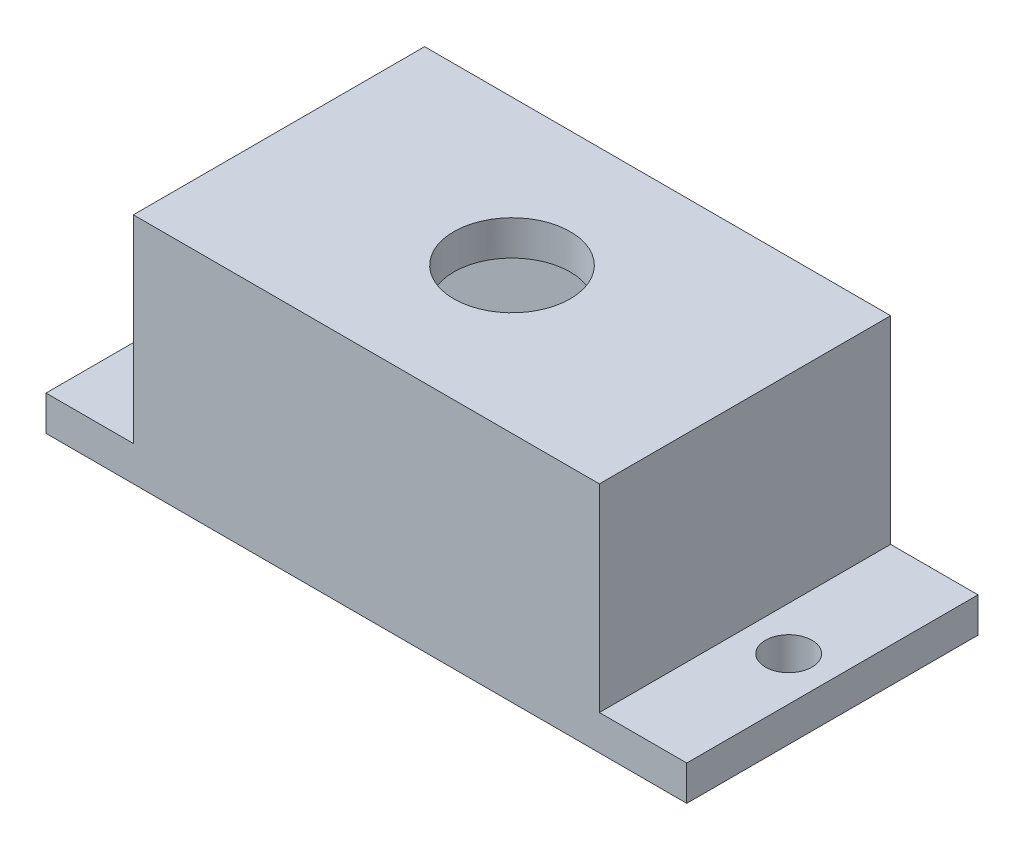
ISO-10303-21;
HEADER;
FILE_DESCRIPTION(('STEP AP214'),'2;1');
FILE_NAME('part.step','',(''),(''),'','','');
FILE_SCHEMA(('AUTOMOTIVE_DESIGN { 1 0 10303 214 1 1 1 1 }'));
ENDSEC;
DATA;
#1=APPLICATION_CONTEXT('core data for automotive mechanical design processes');
#2=APPLICATION_PROTOCOL_DEFINITION('international standard','automotive_design',2000,#1);
#3=PRODUCT_CONTEXT('',#1,'mechanical');
#4=PRODUCT('Part','Part','',(#3));
#5=PRODUCT_RELATED_PRODUCT_CATEGORY('part','',(#4));
#6=PRODUCT_DEFINITION_FORMATION('','',#4);
#7=PRODUCT_DEFINITION_CONTEXT('part definition',#1,'design');
#8=PRODUCT_DEFINITION('design','',#6,#7);
#9=PRODUCT_DEFINITION_SHAPE('','',#8);
#10=(LENGTH_UNIT() NAMED_UNIT(*) SI_UNIT(.MILLI.,.METRE.));
#11=(NAMED_UNIT(*) PLANE_ANGLE_UNIT() SI_UNIT($,.RADIAN.));
#12=(NAMED_UNIT(*) SI_UNIT($,.STERADIAN.) SOLID_ANGLE_UNIT());
#13=UNCERTAINTY_MEASURE_WITH_UNIT(LENGTH_MEASURE(1.E-05),#10,'distance_accuracy_value','');
#14=(GEOMETRIC_REPRESENTATION_CONTEXT(3) GLOBAL_UNCERTAINTY_ASSIGNED_CONTEXT((#13)) GLOBAL_UNIT_ASSIGNED_CONTEXT((#10,
#11,#12)) REPRESENTATION_CONTEXT('',''));
#15=CARTESIAN_POINT('',(0.,0.,0.));
#16=DIRECTION('',(0.,0.,1.));
#17=DIRECTION('',(1.,0.,0.));
#18=AXIS2_PLACEMENT_3D('',#15,#16,#17);
#19=CARTESIAN_POINT('',(0.,0.,0.));
#20=DIRECTION('',(0.,-1.,0.));
#21=DIRECTION('',(0.,0.,-1.));
#22=AXIS2_PLACEMENT_3D('',#19,#20,#21);
#23=PLANE('',#22);
#24=DIRECTION('',(0.,0.,1.));
#25=VECTOR('',#24,1.);
#26=CARTESIAN_POINT('',(-55.,0.,25.));
#27=LINE('',#26,#25);
#28=CARTESIAN_POINT('',(-55.,0.,-25.));
#29=VERTEX_POINT('',#28);
#30=CARTESIAN_POINT('',(-55.,0.,25.));
#31=VERTEX_POINT('',#30);
#32=EDGE_CURVE('E245',#29,#31,#27,.T.);
#33=ORIENTED_EDGE('',*,*,#32,.F.);
#34=DIRECTION('',(-1.,0.,0.));
#35=VECTOR('',#34,1.);
#36=CARTESIAN_POINT('',(-55.,0.,-25.));
#37=LINE('',#36,#35);
#38=CARTESIAN_POINT('',(55.,0.,-25.));
#39=VERTEX_POINT('',#38);
#40=EDGE_CURVE('E251',#39,#29,#37,.T.);
#41=ORIENTED_EDGE('',*,*,#40,.F.);
#42=DIRECTION('',(0.,0.,-1.));
#43=VECTOR('',#42,1.);
#44=CARTESIAN_POINT('',(55.,0.,-25.));
#45=LINE('',#44,#43);
#46=CARTESIAN_POINT('',(55.,0.,25.));
#47=VERTEX_POINT('',#46);
#48=EDGE_CURVE('E269',#47,#39,#45,.T.);
#49=ORIENTED_EDGE('',*,*,#48,.F.);
#50=DIRECTION('',(1.,0.,0.));
#51=VECTOR('',#50,1.);
#52=CARTESIAN_POINT('',(55.,0.,25.));
#53=LINE('',#52,#51);
#54=EDGE_CURVE('E266',#31,#47,#53,.T.);
#55=ORIENTED_EDGE('',*,*,#54,.F.);
#56=EDGE_LOOP('',(#33,#41,#49,#55));
#57=FACE_BOUND('',#56,.T.);
#58=CARTESIAN_POINT('',(47.5,0.,0.));
#59=DIRECTION('',(0.,-1.,0.));
#60=DIRECTION('',(0.,0.,-1.));
#61=AXIS2_PLACEMENT_3D('',#58,#59,#60);
#62=CIRCLE('',#61,4.);
#63=CARTESIAN_POINT('',(47.5,0.,-4.));
#64=VERTEX_POINT('',#63);
#65=EDGE_CURVE('E176',#64,#64,#62,.T.);
#66=ORIENTED_EDGE('',*,*,#65,.F.);
#67=EDGE_LOOP('',(#66));
#68=FACE_BOUND('',#67,.T.);
#69=CARTESIAN_POINT('',(-47.5,0.,0.));
#70=DIRECTION('',(0.,-1.,0.));
#71=DIRECTION('',(0.,0.,-1.));
#72=AXIS2_PLACEMENT_3D('',#69,#70,#71);
#73=CIRCLE('',#72,4.);
#74=CARTESIAN_POINT('',(-47.5,0.,-4.));
#75=VERTEX_POINT('',#74);
#76=EDGE_CURVE('E56',#75,#75,#73,.T.);
#77=ORIENTED_EDGE('',*,*,#76,.F.);
#78=EDGE_LOOP('',(#77));
#79=FACE_BOUND('',#78,.T.);
#80=DIRECTION('',(-1.,0.,0.));
#81=VECTOR('',#80,1.);
#82=CARTESIAN_POINT('',(-35.,0.,-20.));
#83=LINE('',#82,#81);
#84=CARTESIAN_POINT('',(35.,0.,-20.));
#85=VERTEX_POINT('',#84);
#86=CARTESIAN_POINT('',(-35.,0.,-20.));
#87=VERTEX_POINT('',#86);
#88=EDGE_CURVE('E167',#85,#87,#83,.T.);
#89=ORIENTED_EDGE('',*,*,#88,.T.);
#90=DIRECTION('',(0.,0.,1.));
#91=VECTOR('',#90,1.);
#92=CARTESIAN_POINT('',(-35.,0.,20.));
#93=LINE('',#92,#91);
#94=CARTESIAN_POINT('',(-35.,0.,20.));
#95=VERTEX_POINT('',#94);
#96=EDGE_CURVE('E149',#87,#95,#93,.T.);
#97=ORIENTED_EDGE('',*,*,#96,.T.);
#98=DIRECTION('',(1.,0.,0.));
#99=VECTOR('',#98,1.);
#100=CARTESIAN_POINT('',(35.,0.,20.));
#101=LINE('',#100,#99);
#102=CARTESIAN_POINT('',(35.,0.,20.));
#103=VERTEX_POINT('',#102);
#104=EDGE_CURVE('E158',#95,#103,#101,.T.);
#105=ORIENTED_EDGE('',*,*,#104,.T.);
#106=DIRECTION('',(0.,0.,-1.));
#107=VECTOR('',#106,1.);
#108=CARTESIAN_POINT('',(35.,0.,-20.));
#109=LINE('',#108,#107);
#110=EDGE_CURVE('E165',#103,#85,#109,.T.);
#111=ORIENTED_EDGE('',*,*,#110,.T.);
#112=EDGE_LOOP('',(#89,#97,#105,#111));
#113=FACE_BOUND('',#112,.T.);
#114=ADVANCED_FACE('F51',(#57,#68,#79,#113),#23,.T.);
#115=CARTESIAN_POINT('',(0.,6.,0.));
#116=DIRECTION('',(0.,-1.,0.));
#117=DIRECTION('',(0.,0.,-1.));
#118=AXIS2_PLACEMENT_3D('',#115,#116,#117);
#119=PLANE('',#118);
#120=CARTESIAN_POINT('',(-47.5,6.00000000000001,0.));
#121=DIRECTION('',(0.,-1.,0.));
#122=DIRECTION('',(0.,0.,-1.));
#123=AXIS2_PLACEMENT_3D('',#120,#121,#122);
#124=CIRCLE('',#123,4.);
#125=CARTESIAN_POINT('',(-47.5,6.00000000000001,-4.));
#126=VERTEX_POINT('',#125);
#127=EDGE_CURVE('E181',#126,#126,#124,.T.);
#128=ORIENTED_EDGE('',*,*,#127,.T.);
#129=EDGE_LOOP('',(#128));
#130=FACE_BOUND('',#129,.T.);
#131=DIRECTION('',(0.,0.,1.));
#132=VECTOR('',#131,1.);
#133=CARTESIAN_POINT('',(-40.,6.,25.));
#134=LINE('',#133,#132);
#135=CARTESIAN_POINT('',(-40.,6.,-25.));
#136=VERTEX_POINT('',#135);
#137=CARTESIAN_POINT('',(-40.,6.,25.));
#138=VERTEX_POINT('',#137);
#139=EDGE_CURVE('E78',#136,#138,#134,.T.);
#140=ORIENTED_EDGE('',*,*,#139,.F.);
#141=DIRECTION('',(-1.,0.,0.));
#142=VECTOR('',#141,1.);
#143=CARTESIAN_POINT('',(-55.,6.,-25.));
#144=LINE('',#143,#142);
#145=CARTESIAN_POINT('',(-55.,6.,-25.));
#146=VERTEX_POINT('',#145);
#147=EDGE_CURVE('E258',#136,#146,#144,.T.);
#148=ORIENTED_EDGE('',*,*,#147,.T.);
#149=DIRECTION('',(0.,0.,1.));
#150=VECTOR('',#149,1.);
#151=CARTESIAN_POINT('',(-55.,6.,25.));
#152=LINE('',#151,#150);
#153=CARTESIAN_POINT('',(-55.,6.,25.));
#154=VERTEX_POINT('',#153);
#155=EDGE_CURVE('E246',#146,#154,#152,.T.);
#156=ORIENTED_EDGE('',*,*,#155,.T.);
#157=DIRECTION('',(1.,0.,0.));
#158=VECTOR('',#157,1.);
#159=CARTESIAN_POINT('',(55.,6.,25.));
#160=LINE('',#159,#158);
#161=EDGE_CURVE('E252',#154,#138,#160,.T.);
#162=ORIENTED_EDGE('',*,*,#161,.T.);
#163=EDGE_LOOP('',(#140,#148,#156,#162));
#164=FACE_BOUND('',#163,.T.);
#165=ADVANCED_FACE('F292',(#130,#164),#119,.F.);
#166=CARTESIAN_POINT('',(47.5,6.00000000000001,0.));
#167=DIRECTION('',(0.,-1.,0.));
#168=DIRECTION('',(0.,0.,-1.));
#169=AXIS2_PLACEMENT_3D('',#166,#167,#168);
#170=CIRCLE('',#169,4.);
#171=CARTESIAN_POINT('',(47.5,6.00000000000001,-4.));
#172=VERTEX_POINT('',#171);
#173=EDGE_CURVE('E177',#172,#172,#170,.T.);
#174=ORIENTED_EDGE('',*,*,#173,.T.);
#175=EDGE_LOOP('',(#174));
#176=FACE_BOUND('',#175,.T.);
#177=DIRECTION('',(0.,0.,-1.));
#178=VECTOR('',#177,1.);
#179=CARTESIAN_POINT('',(40.,6.,-25.));
#180=LINE('',#179,#178);
#181=CARTESIAN_POINT('',(40.,6.,25.));
#182=VERTEX_POINT('',#181);
#183=CARTESIAN_POINT('',(40.,6.,-25.));
#184=VERTEX_POINT('',#183);
#185=EDGE_CURVE('E216',#182,#184,#180,.T.);
#186=ORIENTED_EDGE('',*,*,#185,.F.);
#187=CARTESIAN_POINT('',(55.,6.,25.));
#188=VERTEX_POINT('',#187);
#189=EDGE_CURVE('E250',#182,#188,#160,.T.);
#190=ORIENTED_EDGE('',*,*,#189,.T.);
#191=DIRECTION('',(0.,0.,-1.));
#192=VECTOR('',#191,1.);
#193=CARTESIAN_POINT('',(55.,6.,-25.));
#194=LINE('',#193,#192);
#195=CARTESIAN_POINT('',(55.,6.,-25.));
#196=VERTEX_POINT('',#195);
#197=EDGE_CURVE('E255',#188,#196,#194,.T.);
#198=ORIENTED_EDGE('',*,*,#197,.T.);
#199=EDGE_CURVE('E259',#196,#184,#144,.T.);
#200=ORIENTED_EDGE('',*,*,#199,.T.);
#201=EDGE_LOOP('',(#186,#190,#198,#200));
#202=FACE_BOUND('',#201,.T.);
#203=ADVANCED_FACE('F328',(#176,#202),#119,.F.);
#204=CARTESIAN_POINT('',(-55.,6.,25.));
#205=DIRECTION('',(1.,0.,0.));
#206=DIRECTION('',(0.,0.,-1.));
#207=AXIS2_PLACEMENT_3D('',#204,#205,#206);
#208=PLANE('',#207);
#209=ORIENTED_EDGE('',*,*,#32,.T.);
#210=DIRECTION('',(0.,-1.,0.));
#211=VECTOR('',#210,1.);
#212=CARTESIAN_POINT('',(-55.,6.,25.));
#213=LINE('',#212,#211);
#214=EDGE_CURVE('E11',#154,#31,#213,.T.);
#215=ORIENTED_EDGE('',*,*,#214,.F.);
#216=ORIENTED_EDGE('',*,*,#155,.F.);
#217=DIRECTION('',(0.,-1.,0.));
#218=VECTOR('',#217,1.);
#219=CARTESIAN_POINT('',(-55.,6.,-25.));
#220=LINE('',#219,#218);
#221=EDGE_CURVE('E262',#146,#29,#220,.T.);
#222=ORIENTED_EDGE('',*,*,#221,.T.);
#223=EDGE_LOOP('',(#209,#215,#216,#222));
#224=FACE_BOUND('',#223,.T.);
#225=ADVANCED_FACE('F54',(#224),#208,.F.);
#226=CARTESIAN_POINT('',(55.,6.,25.));
#227=DIRECTION('',(0.,0.,-1.));
#228=DIRECTION('',(-1.,0.,0.));
#229=AXIS2_PLACEMENT_3D('',#226,#227,#228);
#230=PLANE('',#229);
#231=ORIENTED_EDGE('',*,*,#54,.T.);
#232=DIRECTION('',(0.,-1.,0.));
#233=VECTOR('',#232,1.);
#234=CARTESIAN_POINT('',(55.,6.,25.));
#235=LINE('',#234,#233);
#236=EDGE_CURVE('E62',#188,#47,#235,.T.);
#237=ORIENTED_EDGE('',*,*,#236,.F.);
#238=ORIENTED_EDGE('',*,*,#189,.F.);
#239=DIRECTION('',(0.,-1.,0.));
#240=VECTOR('',#239,1.);
#241=CARTESIAN_POINT('',(40.,40.,25.));
#242=LINE('',#241,#240);
#243=CARTESIAN_POINT('',(40.,40.,25.));
#244=VERTEX_POINT('',#243);
#245=EDGE_CURVE('E237',#244,#182,#242,.T.);
#246=ORIENTED_EDGE('',*,*,#245,.F.);
#247=DIRECTION('',(1.,0.,0.));
#248=VECTOR('',#247,1.);
#249=CARTESIAN_POINT('',(40.,40.,25.));
#250=LINE('',#249,#248);
#251=CARTESIAN_POINT('',(-40.,40.,25.));
#252=VERTEX_POINT('',#251);
#253=EDGE_CURVE('E215',#252,#244,#250,.T.);
#254=ORIENTED_EDGE('',*,*,#253,.F.);
#255=DIRECTION('',(0.,-1.,0.));
#256=VECTOR('',#255,1.);
#257=CARTESIAN_POINT('',(-40.,40.,25.));
#258=LINE('',#257,#256);
#259=EDGE_CURVE('E241',#252,#138,#258,.T.);
#260=ORIENTED_EDGE('',*,*,#259,.T.);
#261=ORIENTED_EDGE('',*,*,#161,.F.);
#262=ORIENTED_EDGE('',*,*,#214,.T.);
#263=EDGE_LOOP('',(#231,#237,#238,#246,#254,#260,#261,#262));
#264=FACE_BOUND('',#263,.T.);
#265=ADVANCED_FACE('F311',(#264),#230,.F.);
#266=CARTESIAN_POINT('',(55.,6.,-25.));
#267=DIRECTION('',(-1.,0.,0.));
#268=DIRECTION('',(0.,0.,1.));
#269=AXIS2_PLACEMENT_3D('',#266,#267,#268);
#270=PLANE('',#269);
#271=ORIENTED_EDGE('',*,*,#48,.T.);
#272=DIRECTION('',(0.,-1.,0.));
#273=VECTOR('',#272,1.);
#274=CARTESIAN_POINT('',(55.,6.,-25.));
#275=LINE('',#274,#273);
#276=EDGE_CURVE('E277',#196,#39,#275,.T.);
#277=ORIENTED_EDGE('',*,*,#276,.F.);
#278=ORIENTED_EDGE('',*,*,#197,.F.);
#279=ORIENTED_EDGE('',*,*,#236,.T.);
#280=EDGE_LOOP('',(#271,#277,#278,#279));
#281=FACE_BOUND('',#280,.T.);
#282=ADVANCED_FACE('F333',(#281),#270,.F.);
#283=CARTESIAN_POINT('',(-55.,6.,-25.));
#284=DIRECTION('',(0.,0.,1.));
#285=DIRECTION('',(1.,0.,0.));
#286=AXIS2_PLACEMENT_3D('',#283,#284,#285);
#287=PLANE('',#286);
#288=ORIENTED_EDGE('',*,*,#40,.T.);
#289=ORIENTED_EDGE('',*,*,#221,.F.);
#290=ORIENTED_EDGE('',*,*,#147,.F.);
#291=DIRECTION('',(0.,-1.,0.));
#292=VECTOR('',#291,1.);
#293=CARTESIAN_POINT('',(-40.,40.,-25.));
#294=LINE('',#293,#292);
#295=CARTESIAN_POINT('',(-40.,40.,-25.));
#296=VERTEX_POINT('',#295);
#297=EDGE_CURVE('E225',#296,#136,#294,.T.);
#298=ORIENTED_EDGE('',*,*,#297,.F.);
#299=DIRECTION('',(-1.,0.,0.));
#300=VECTOR('',#299,1.);
#301=CARTESIAN_POINT('',(-40.,40.,-25.));
#302=LINE('',#301,#300);
#303=CARTESIAN_POINT('',(40.,40.,-25.));
#304=VERTEX_POINT('',#303);
#305=EDGE_CURVE('E222',#304,#296,#302,.T.);
#306=ORIENTED_EDGE('',*,*,#305,.F.);
#307=DIRECTION('',(0.,-1.,0.));
#308=VECTOR('',#307,1.);
#309=CARTESIAN_POINT('',(40.,40.,-25.));
#310=LINE('',#309,#308);
#311=EDGE_CURVE('E233',#304,#184,#310,.T.);
#312=ORIENTED_EDGE('',*,*,#311,.T.);
#313=ORIENTED_EDGE('',*,*,#199,.F.);
#314=ORIENTED_EDGE('',*,*,#276,.T.);
#315=EDGE_LOOP('',(#288,#289,#290,#298,#306,#312,#313,#314));
#316=FACE_BOUND('',#315,.T.);
#317=ADVANCED_FACE('F306',(#316),#287,.F.);
#318=CARTESIAN_POINT('',(-40.,40.,25.));
#319=DIRECTION('',(1.,0.,0.));
#320=DIRECTION('',(0.,0.,-1.));
#321=AXIS2_PLACEMENT_3D('',#318,#319,#320);
#322=PLANE('',#321);
#323=ORIENTED_EDGE('',*,*,#139,.T.);
#324=ORIENTED_EDGE('',*,*,#259,.F.);
#325=DIRECTION('',(0.,0.,1.));
#326=VECTOR('',#325,1.);
#327=CARTESIAN_POINT('',(-40.,40.,25.));
#328=LINE('',#327,#326);
#329=EDGE_CURVE('E211',#296,#252,#328,.T.);
#330=ORIENTED_EDGE('',*,*,#329,.F.);
#331=ORIENTED_EDGE('',*,*,#297,.T.);
#332=EDGE_LOOP('',(#323,#324,#330,#331));
#333=FACE_BOUND('',#332,.T.);
#334=ADVANCED_FACE('F317',(#333),#322,.F.);
#335=CARTESIAN_POINT('',(40.,40.,-25.));
#336=DIRECTION('',(-1.,0.,0.));
#337=DIRECTION('',(0.,0.,1.));
#338=AXIS2_PLACEMENT_3D('',#335,#336,#337);
#339=PLANE('',#338);
#340=ORIENTED_EDGE('',*,*,#185,.T.);
#341=ORIENTED_EDGE('',*,*,#311,.F.);
#342=DIRECTION('',(0.,0.,-1.));
#343=VECTOR('',#342,1.);
#344=CARTESIAN_POINT('',(40.,40.,-25.));
#345=LINE('',#344,#343);
#346=EDGE_CURVE('E219',#244,#304,#345,.T.);
#347=ORIENTED_EDGE('',*,*,#346,.F.);
#348=ORIENTED_EDGE('',*,*,#245,.T.);
#349=EDGE_LOOP('',(#340,#341,#347,#348));
#350=FACE_BOUND('',#349,.T.);
#351=ADVANCED_FACE('F325',(#350),#339,.F.);
#352=CARTESIAN_POINT('',(0.,40.,0.));
#353=DIRECTION('',(0.,-1.,0.));
#354=DIRECTION('',(0.,0.,-1.));
#355=AXIS2_PLACEMENT_3D('',#352,#353,#354);
#356=PLANE('',#355);
#357=CARTESIAN_POINT('',(0.,40.,0.));
#358=DIRECTION('',(0.,1.,0.));
#359=DIRECTION('',(0.,0.,1.));
#360=AXIS2_PLACEMENT_3D('',#357,#358,#359);
#361=CIRCLE('',#360,10.);
#362=CARTESIAN_POINT('',(0.,40.,10.));
#363=VERTEX_POINT('',#362);
#364=EDGE_CURVE('E185',#363,#363,#361,.T.);
#365=ORIENTED_EDGE('',*,*,#364,.F.);
#366=EDGE_LOOP('',(#365));
#367=FACE_BOUND('',#366,.T.);
#368=ORIENTED_EDGE('',*,*,#329,.T.);
#369=ORIENTED_EDGE('',*,*,#253,.T.);
#370=ORIENTED_EDGE('',*,*,#346,.T.);
#371=ORIENTED_EDGE('',*,*,#305,.T.);
#372=EDGE_LOOP('',(#368,#369,#370,#371));
#373=FACE_BOUND('',#372,.T.);
#374=ADVANCED_FACE('F322',(#367,#373),#356,.F.);
#375=CARTESIAN_POINT('',(0.,0.,0.));
#376=DIRECTION('',(0.,1.,0.));
#377=DIRECTION('',(0.,0.,1.));
#378=AXIS2_PLACEMENT_3D('',#375,#376,#377);
#379=CYLINDRICAL_SURFACE('',#378,10.);
#380=CARTESIAN_POINT('',(0.,34.,0.));
#381=DIRECTION('',(0.,-1.,0.));
#382=DIRECTION('',(0.,0.,-1.));
#383=AXIS2_PLACEMENT_3D('',#380,#381,#382);
#384=CIRCLE('',#383,10.);
#385=CARTESIAN_POINT('',(0.,34.,-10.));
#386=VERTEX_POINT('',#385);
#387=EDGE_CURVE('E189',#386,#386,#384,.T.);
#388=ORIENTED_EDGE('',*,*,#387,.T.);
#389=EDGE_LOOP('',(#388));
#390=FACE_BOUND('',#389,.T.);
#391=ORIENTED_EDGE('',*,*,#364,.T.);
#392=EDGE_LOOP('',(#391));
#393=FACE_BOUND('',#392,.T.);
#394=ADVANCED_FACE('F359',(#390,#393),#379,.F.);
#395=CARTESIAN_POINT('',(-35.,34.,20.));
#396=DIRECTION('',(1.,0.,0.));
#397=DIRECTION('',(0.,0.,-1.));
#398=AXIS2_PLACEMENT_3D('',#395,#396,#397);
#399=PLANE('',#398);
#400=DIRECTION('',(0.,-1.,0.));
#401=VECTOR('',#400,1.);
#402=CARTESIAN_POINT('',(-35.,34.,20.));
#403=LINE('',#402,#401);
#404=CARTESIAN_POINT('',(-35.,34.,20.));
#405=VERTEX_POINT('',#404);
#406=EDGE_CURVE('E145',#405,#95,#403,.T.);
#407=ORIENTED_EDGE('',*,*,#406,.T.);
#408=ORIENTED_EDGE('',*,*,#96,.F.);
#409=DIRECTION('',(0.,-1.,0.));
#410=VECTOR('',#409,1.);
#411=CARTESIAN_POINT('',(-35.,34.,-20.));
#412=LINE('',#411,#410);
#413=CARTESIAN_POINT('',(-35.,34.,-20.));
#414=VERTEX_POINT('',#413);
#415=EDGE_CURVE('E70',#414,#87,#412,.T.);
#416=ORIENTED_EDGE('',*,*,#415,.F.);
#417=DIRECTION('',(0.,0.,1.));
#418=VECTOR('',#417,1.);
#419=CARTESIAN_POINT('',(-35.,34.,20.));
#420=LINE('',#419,#418);
#421=EDGE_CURVE('E152',#414,#405,#420,.T.);
#422=ORIENTED_EDGE('',*,*,#421,.T.);
#423=EDGE_LOOP('',(#407,#408,#416,#422));
#424=FACE_BOUND('',#423,.T.);
#425=ADVANCED_FACE('F147',(#424),#399,.T.);
#426=CARTESIAN_POINT('',(35.,34.,20.));
#427=DIRECTION('',(0.,0.,-1.));
#428=DIRECTION('',(-1.,0.,0.));
#429=AXIS2_PLACEMENT_3D('',#426,#427,#428);
#430=PLANE('',#429);
#431=DIRECTION('',(0.,-1.,0.));
#432=VECTOR('',#431,1.);
#433=CARTESIAN_POINT('',(35.,34.,20.));
#434=LINE('',#433,#432);
#435=CARTESIAN_POINT('',(35.,34.,20.));
#436=VERTEX_POINT('',#435);
#437=EDGE_CURVE('E155',#436,#103,#434,.T.);
#438=ORIENTED_EDGE('',*,*,#437,.T.);
#439=ORIENTED_EDGE('',*,*,#104,.F.);
#440=ORIENTED_EDGE('',*,*,#406,.F.);
#441=DIRECTION('',(1.,0.,0.));
#442=VECTOR('',#441,1.);
#443=CARTESIAN_POINT('',(35.,34.,20.));
#444=LINE('',#443,#442);
#445=EDGE_CURVE('E195',#405,#436,#444,.T.);
#446=ORIENTED_EDGE('',*,*,#445,.T.);
#447=EDGE_LOOP('',(#438,#439,#440,#446));
#448=FACE_BOUND('',#447,.T.);
#449=ADVANCED_FACE('F159',(#448),#430,.T.);
#450=CARTESIAN_POINT('',(35.,34.,-20.));
#451=DIRECTION('',(-1.,0.,0.));
#452=DIRECTION('',(0.,0.,1.));
#453=AXIS2_PLACEMENT_3D('',#450,#451,#452);
#454=PLANE('',#453);
#455=DIRECTION('',(0.,-1.,0.));
#456=VECTOR('',#455,1.);
#457=CARTESIAN_POINT('',(35.,34.,-20.));
#458=LINE('',#457,#456);
#459=CARTESIAN_POINT('',(35.,34.,-20.));
#460=VERTEX_POINT('',#459);
#461=EDGE_CURVE('E206',#460,#85,#458,.T.);
#462=ORIENTED_EDGE('',*,*,#461,.T.);
#463=ORIENTED_EDGE('',*,*,#110,.F.);
#464=ORIENTED_EDGE('',*,*,#437,.F.);
#465=DIRECTION('',(0.,0.,-1.));
#466=VECTOR('',#465,1.);
#467=CARTESIAN_POINT('',(35.,34.,-20.));
#468=LINE('',#467,#466);
#469=EDGE_CURVE('E198',#436,#460,#468,.T.);
#470=ORIENTED_EDGE('',*,*,#469,.T.);
#471=EDGE_LOOP('',(#462,#463,#464,#470));
#472=FACE_BOUND('',#471,.T.);
#473=ADVANCED_FACE('F368',(#472),#454,.T.);
#474=CARTESIAN_POINT('',(-35.,34.,-20.));
#475=DIRECTION('',(0.,0.,1.));
#476=DIRECTION('',(1.,0.,0.));
#477=AXIS2_PLACEMENT_3D('',#474,#475,#476);
#478=PLANE('',#477);
#479=ORIENTED_EDGE('',*,*,#415,.T.);
#480=ORIENTED_EDGE('',*,*,#88,.F.);
#481=ORIENTED_EDGE('',*,*,#461,.F.);
#482=DIRECTION('',(-1.,0.,0.));
#483=VECTOR('',#482,1.);
#484=CARTESIAN_POINT('',(-35.,34.,-20.));
#485=LINE('',#484,#483);
#486=EDGE_CURVE('E201',#460,#414,#485,.T.);
#487=ORIENTED_EDGE('',*,*,#486,.T.);
#488=EDGE_LOOP('',(#479,#480,#481,#487));
#489=FACE_BOUND('',#488,.T.);
#490=ADVANCED_FACE('F372',(#489),#478,.T.);
#491=CARTESIAN_POINT('',(0.,34.,0.));
#492=DIRECTION('',(0.,-1.,0.));
#493=DIRECTION('',(0.,0.,-1.));
#494=AXIS2_PLACEMENT_3D('',#491,#492,#493);
#495=PLANE('',#494);
#496=ORIENTED_EDGE('',*,*,#387,.F.);
#497=EDGE_LOOP('',(#496));
#498=FACE_BOUND('',#497,.T.);
#499=ORIENTED_EDGE('',*,*,#421,.F.);
#500=ORIENTED_EDGE('',*,*,#486,.F.);
#501=ORIENTED_EDGE('',*,*,#469,.F.);
#502=ORIENTED_EDGE('',*,*,#445,.F.);
#503=EDGE_LOOP('',(#499,#500,#501,#502));
#504=FACE_BOUND('',#503,.T.);
#505=ADVANCED_FACE('F377',(#498,#504),#495,.T.);
#506=CARTESIAN_POINT('',(47.5,-105.,0.));
#507=DIRECTION('',(0.,1.,0.));
#508=DIRECTION('',(0.,0.,1.));
#509=AXIS2_PLACEMENT_3D('',#506,#507,#508);
#510=CYLINDRICAL_SURFACE('',#509,4.);
#511=ORIENTED_EDGE('',*,*,#65,.T.);
#512=EDGE_LOOP('',(#511));
#513=FACE_BOUND('',#512,.T.);
#514=ORIENTED_EDGE('',*,*,#173,.F.);
#515=EDGE_LOOP('',(#514));
#516=FACE_BOUND('',#515,.T.);
#517=ADVANCED_FACE('F287',(#513,#516),#510,.F.);
#518=CARTESIAN_POINT('',(-47.5,-105.,0.));
#519=DIRECTION('',(0.,1.,0.));
#520=DIRECTION('',(0.,0.,1.));
#521=AXIS2_PLACEMENT_3D('',#518,#519,#520);
#522=CYLINDRICAL_SURFACE('',#521,4.);
#523=ORIENTED_EDGE('',*,*,#76,.T.);
#524=EDGE_LOOP('',(#523));
#525=FACE_BOUND('',#524,.T.);
#526=ORIENTED_EDGE('',*,*,#127,.F.);
#527=EDGE_LOOP('',(#526));
#528=FACE_BOUND('',#527,.T.);
#529=ADVANCED_FACE('F388',(#525,#528),#522,.F.);
#530=CLOSED_SHELL('',(#114,#165,#203,#225,#265,#282,#317,#334,#351,#374,#394,#425,#449,#473,
#490,#505,#517,#529));
#531=MANIFOLD_SOLID_BREP('B2',#530);
#532=ADVANCED_BREP_SHAPE_REPRESENTATION('',(#18,#531),#14);
#533=SHAPE_DEFINITION_REPRESENTATION(#9,#532);
ENDSEC;
END-ISO-10303-21;
